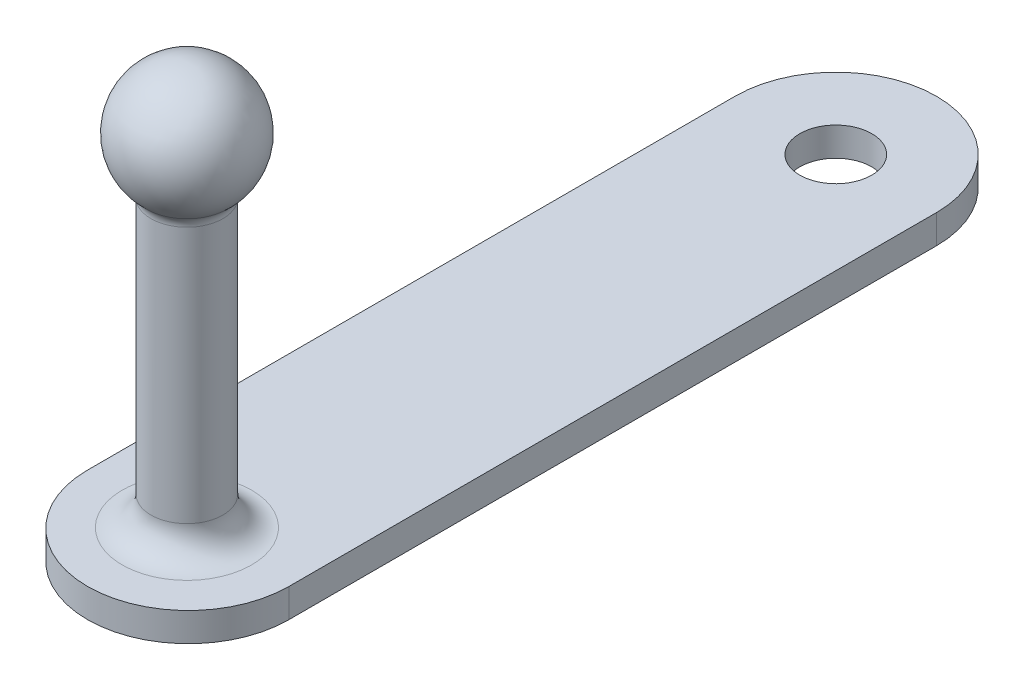
ISO-10303-21;
HEADER;
FILE_DESCRIPTION(('STEP AP214'),'2;1');
FILE_NAME('part.step','',(''),(''),'','','');
FILE_SCHEMA(('AUTOMOTIVE_DESIGN { 1 0 10303 214 1 1 1 1 }'));
ENDSEC;
DATA;
#1=APPLICATION_CONTEXT('core data for automotive mechanical design processes');
#2=APPLICATION_PROTOCOL_DEFINITION('international standard','automotive_design',2000,#1);
#3=PRODUCT_CONTEXT('',#1,'mechanical');
#4=PRODUCT('Part','Part','',(#3));
#5=PRODUCT_RELATED_PRODUCT_CATEGORY('part','',(#4));
#6=PRODUCT_DEFINITION_FORMATION('','',#4);
#7=PRODUCT_DEFINITION_CONTEXT('part definition',#1,'design');
#8=PRODUCT_DEFINITION('design','',#6,#7);
#9=PRODUCT_DEFINITION_SHAPE('','',#8);
#10=(LENGTH_UNIT() NAMED_UNIT(*) SI_UNIT(.MILLI.,.METRE.));
#11=(NAMED_UNIT(*) PLANE_ANGLE_UNIT() SI_UNIT($,.RADIAN.));
#12=(NAMED_UNIT(*) SI_UNIT($,.STERADIAN.) SOLID_ANGLE_UNIT());
#13=UNCERTAINTY_MEASURE_WITH_UNIT(LENGTH_MEASURE(1.E-05),#10,'distance_accuracy_value','');
#14=(GEOMETRIC_REPRESENTATION_CONTEXT(3) GLOBAL_UNCERTAINTY_ASSIGNED_CONTEXT((#13)) GLOBAL_UNIT_ASSIGNED_CONTEXT((#10,
#11,#12)) REPRESENTATION_CONTEXT('',''));
#15=CARTESIAN_POINT('',(0.,0.,0.));
#16=DIRECTION('',(0.,0.,1.));
#17=DIRECTION('',(1.,0.,0.));
#18=AXIS2_PLACEMENT_3D('',#15,#16,#17);
#19=CARTESIAN_POINT('',(2.5,0.,0.));
#20=DIRECTION('',(0.,-1.,0.));
#21=DIRECTION('',(0.,0.,-1.));
#22=AXIS2_PLACEMENT_3D('',#19,#20,#21);
#23=CYLINDRICAL_SURFACE('',#22,2.5);
#24=CARTESIAN_POINT('',(2.5,21.8368810393754,0.));
#25=DIRECTION('',(0.,1.,0.));
#26=DIRECTION('',(0.,0.,1.));
#27=AXIS2_PLACEMENT_3D('',#24,#25,#26);
#28=CIRCLE('',#27,2.5);
#29=CARTESIAN_POINT('',(2.5,21.8368810393754,2.5));
#30=VERTEX_POINT('',#29);
#31=EDGE_CURVE('E49',#30,#30,#28,.F.);
#32=ORIENTED_EDGE('',*,*,#31,.T.);
#33=EDGE_LOOP('',(#32));
#34=FACE_BOUND('',#33,.T.);
#35=CARTESIAN_POINT('',(2.5,4.,0.));
#36=DIRECTION('',(0.,-1.,0.));
#37=DIRECTION('',(0.,0.,-1.));
#38=AXIS2_PLACEMENT_3D('',#35,#36,#37);
#39=CIRCLE('',#38,2.5);
#40=CARTESIAN_POINT('',(2.5,4.,-2.5));
#41=VERTEX_POINT('',#40);
#42=EDGE_CURVE('E137',#41,#41,#39,.F.);
#43=ORIENTED_EDGE('',*,*,#42,.T.);
#44=EDGE_LOOP('',(#43));
#45=FACE_BOUND('',#44,.T.);
#46=ADVANCED_FACE('F39',(#34,#45),#23,.T.);
#47=CARTESIAN_POINT('',(2.5,25.75,0.));
#48=DIRECTION('',(0.,-1.,0.));
#49=DIRECTION('',(1.,0.,0.));
#50=AXIS2_PLACEMENT_3D('',#47,#48,#49);
#51=SPHERICAL_SURFACE('',#50,4.25);
#52=CARTESIAN_POINT('',(2.5,22.5822370318753,0.));
#53=DIRECTION('',(0.,1.,0.));
#54=DIRECTION('',(0.,0.,1.));
#55=AXIS2_PLACEMENT_3D('',#52,#53,#54);
#56=CIRCLE('',#55,2.83333333333333);
#57=CARTESIAN_POINT('',(2.5,22.5822370318753,2.83333333333333));
#58=VERTEX_POINT('',#57);
#59=EDGE_CURVE('E11',#58,#58,#56,.T.);
#60=ORIENTED_EDGE('',*,*,#59,.T.);
#61=EDGE_LOOP('',(#60));
#62=FACE_BOUND('',#61,.T.);
#63=ADVANCED_FACE('F156',(#62),#51,.T.);
#64=CARTESIAN_POINT('',(2.58924949571679,2.,0.));
#65=DIRECTION('',(0.,-1.,0.));
#66=DIRECTION('',(0.,0.,-1.));
#67=AXIS2_PLACEMENT_3D('',#64,#65,#66);
#68=CYLINDRICAL_SURFACE('',#67,7.);
#69=CARTESIAN_POINT('',(2.58924949571679,0.,0.));
#70=DIRECTION('',(0.,-1.,0.));
#71=DIRECTION('',(0.,0.,-1.));
#72=AXIS2_PLACEMENT_3D('',#69,#70,#71);
#73=CIRCLE('',#72,7.);
#74=CARTESIAN_POINT('',(9.58924949571679,0.,0.));
#75=VERTEX_POINT('',#74);
#76=CARTESIAN_POINT('',(-4.41075050428322,0.,0.));
#77=VERTEX_POINT('',#76);
#78=EDGE_CURVE('E114',#75,#77,#73,.T.);
#79=ORIENTED_EDGE('',*,*,#78,.F.);
#80=DIRECTION('',(0.,-1.,0.));
#81=VECTOR('',#80,1.);
#82=CARTESIAN_POINT('',(9.58924949571679,2.,0.));
#83=LINE('',#82,#81);
#84=CARTESIAN_POINT('',(9.58924949571679,2.,0.));
#85=VERTEX_POINT('',#84);
#86=EDGE_CURVE('E57',#85,#75,#83,.T.);
#87=ORIENTED_EDGE('',*,*,#86,.F.);
#88=CARTESIAN_POINT('',(2.58924949571679,2.,0.));
#89=DIRECTION('',(0.,-1.,0.));
#90=DIRECTION('',(0.,0.,-1.));
#91=AXIS2_PLACEMENT_3D('',#88,#89,#90);
#92=CIRCLE('',#91,7.);
#93=CARTESIAN_POINT('',(-4.41075050428322,2.,0.));
#94=VERTEX_POINT('',#93);
#95=EDGE_CURVE('E105',#85,#94,#92,.T.);
#96=ORIENTED_EDGE('',*,*,#95,.T.);
#97=DIRECTION('',(0.,-1.,0.));
#98=VECTOR('',#97,1.);
#99=CARTESIAN_POINT('',(-4.41075050428322,2.,0.));
#100=LINE('',#99,#98);
#101=EDGE_CURVE('E85',#94,#77,#100,.T.);
#102=ORIENTED_EDGE('',*,*,#101,.T.);
#103=EDGE_LOOP('',(#79,#87,#96,#102));
#104=FACE_BOUND('',#103,.T.);
#105=ADVANCED_FACE('F161',(#104),#68,.T.);
#106=CARTESIAN_POINT('',(9.58924949571679,2.,0.));
#107=DIRECTION('',(1.,0.,0.));
#108=DIRECTION('',(0.,0.,-1.));
#109=AXIS2_PLACEMENT_3D('',#106,#107,#108);
#110=PLANE('',#109);
#111=DIRECTION('',(0.,0.,1.));
#112=VECTOR('',#111,1.);
#113=CARTESIAN_POINT('',(9.58924949571679,0.,0.));
#114=LINE('',#113,#112);
#115=CARTESIAN_POINT('',(9.58924949571679,0.,-45.));
#116=VERTEX_POINT('',#115);
#117=EDGE_CURVE('E108',#116,#75,#114,.T.);
#118=ORIENTED_EDGE('',*,*,#117,.F.);
#119=DIRECTION('',(0.,-1.,0.));
#120=VECTOR('',#119,1.);
#121=CARTESIAN_POINT('',(9.58924949571679,2.,-45.));
#122=LINE('',#121,#120);
#123=CARTESIAN_POINT('',(9.58924949571679,2.,-45.));
#124=VERTEX_POINT('',#123);
#125=EDGE_CURVE('E74',#124,#116,#122,.T.);
#126=ORIENTED_EDGE('',*,*,#125,.F.);
#127=DIRECTION('',(0.,0.,1.));
#128=VECTOR('',#127,1.);
#129=CARTESIAN_POINT('',(9.58924949571679,2.,0.));
#130=LINE('',#129,#128);
#131=EDGE_CURVE('E100',#124,#85,#130,.T.);
#132=ORIENTED_EDGE('',*,*,#131,.T.);
#133=ORIENTED_EDGE('',*,*,#86,.T.);
#134=EDGE_LOOP('',(#118,#126,#132,#133));
#135=FACE_BOUND('',#134,.T.);
#136=ADVANCED_FACE('F179',(#135),#110,.T.);
#137=CARTESIAN_POINT('',(2.58924949571679,2.,-45.));
#138=DIRECTION('',(0.,-1.,0.));
#139=DIRECTION('',(0.,0.,-1.));
#140=AXIS2_PLACEMENT_3D('',#137,#138,#139);
#141=CYLINDRICAL_SURFACE('',#140,7.);
#142=CARTESIAN_POINT('',(2.58924949571679,0.,-45.));
#143=DIRECTION('',(0.,-1.,0.));
#144=DIRECTION('',(0.,0.,-1.));
#145=AXIS2_PLACEMENT_3D('',#142,#143,#144);
#146=CIRCLE('',#145,7.);
#147=CARTESIAN_POINT('',(-4.41075050428321,0.,-45.));
#148=VERTEX_POINT('',#147);
#149=EDGE_CURVE('E93',#148,#116,#146,.T.);
#150=ORIENTED_EDGE('',*,*,#149,.F.);
#151=DIRECTION('',(0.,-1.,0.));
#152=VECTOR('',#151,1.);
#153=CARTESIAN_POINT('',(-4.41075050428321,2.,-45.));
#154=LINE('',#153,#152);
#155=CARTESIAN_POINT('',(-4.41075050428321,2.,-45.));
#156=VERTEX_POINT('',#155);
#157=EDGE_CURVE('E88',#156,#148,#154,.T.);
#158=ORIENTED_EDGE('',*,*,#157,.F.);
#159=CARTESIAN_POINT('',(2.58924949571679,2.,-45.));
#160=DIRECTION('',(0.,-1.,0.));
#161=DIRECTION('',(0.,0.,-1.));
#162=AXIS2_PLACEMENT_3D('',#159,#160,#161);
#163=CIRCLE('',#162,7.);
#164=EDGE_CURVE('E91',#156,#124,#163,.T.);
#165=ORIENTED_EDGE('',*,*,#164,.T.);
#166=ORIENTED_EDGE('',*,*,#125,.T.);
#167=EDGE_LOOP('',(#150,#158,#165,#166));
#168=FACE_BOUND('',#167,.T.);
#169=ADVANCED_FACE('F90',(#168),#141,.T.);
#170=CARTESIAN_POINT('',(-4.41075050428322,2.,0.));
#171=DIRECTION('',(-1.,0.,0.));
#172=DIRECTION('',(0.,0.,1.));
#173=AXIS2_PLACEMENT_3D('',#170,#171,#172);
#174=PLANE('',#173);
#175=DIRECTION('',(0.,0.,-1.));
#176=VECTOR('',#175,1.);
#177=CARTESIAN_POINT('',(-4.41075050428322,0.,0.));
#178=LINE('',#177,#176);
#179=EDGE_CURVE('E118',#77,#148,#178,.T.);
#180=ORIENTED_EDGE('',*,*,#179,.F.);
#181=ORIENTED_EDGE('',*,*,#101,.F.);
#182=DIRECTION('',(0.,0.,-1.));
#183=VECTOR('',#182,1.);
#184=CARTESIAN_POINT('',(-4.41075050428322,2.,0.));
#185=LINE('',#184,#183);
#186=EDGE_CURVE('E99',#94,#156,#185,.T.);
#187=ORIENTED_EDGE('',*,*,#186,.T.);
#188=ORIENTED_EDGE('',*,*,#157,.T.);
#189=EDGE_LOOP('',(#180,#181,#187,#188));
#190=FACE_BOUND('',#189,.T.);
#191=ADVANCED_FACE('F103',(#190),#174,.T.);
#192=CARTESIAN_POINT('',(2.58924949571679,2.,0.));
#193=DIRECTION('',(0.,-1.,0.));
#194=DIRECTION('',(0.,0.,-1.));
#195=AXIS2_PLACEMENT_3D('',#192,#193,#194);
#196=PLANE('',#195);
#197=CARTESIAN_POINT('',(2.5,2.,0.));
#198=DIRECTION('',(0.,-1.,0.));
#199=DIRECTION('',(0.,0.,-1.));
#200=AXIS2_PLACEMENT_3D('',#197,#198,#199);
#201=CIRCLE('',#200,4.5);
#202=CARTESIAN_POINT('',(2.5,2.,-4.5));
#203=VERTEX_POINT('',#202);
#204=EDGE_CURVE('E129',#203,#203,#201,.T.);
#205=ORIENTED_EDGE('',*,*,#204,.T.);
#206=EDGE_LOOP('',(#205));
#207=FACE_BOUND('',#206,.T.);
#208=CARTESIAN_POINT('',(2.58924949571679,2.,-45.));
#209=DIRECTION('',(0.,-1.,0.));
#210=DIRECTION('',(0.,0.,-1.));
#211=AXIS2_PLACEMENT_3D('',#208,#209,#210);
#212=CIRCLE('',#211,2.5);
#213=CARTESIAN_POINT('',(2.58924949571679,2.,-47.5));
#214=VERTEX_POINT('',#213);
#215=EDGE_CURVE('E119',#214,#214,#212,.T.);
#216=ORIENTED_EDGE('',*,*,#215,.T.);
#217=EDGE_LOOP('',(#216));
#218=FACE_BOUND('',#217,.T.);
#219=ORIENTED_EDGE('',*,*,#95,.F.);
#220=ORIENTED_EDGE('',*,*,#131,.F.);
#221=ORIENTED_EDGE('',*,*,#164,.F.);
#222=ORIENTED_EDGE('',*,*,#186,.F.);
#223=EDGE_LOOP('',(#219,#220,#221,#222));
#224=FACE_BOUND('',#223,.T.);
#225=ADVANCED_FACE('F98',(#207,#218,#224),#196,.F.);
#226=CARTESIAN_POINT('',(2.58924949571679,2.,-45.));
#227=DIRECTION('',(0.,-1.,0.));
#228=DIRECTION('',(0.,0.,-1.));
#229=AXIS2_PLACEMENT_3D('',#226,#227,#228);
#230=CYLINDRICAL_SURFACE('',#229,2.5);
#231=ORIENTED_EDGE('',*,*,#215,.F.);
#232=EDGE_LOOP('',(#231));
#233=FACE_BOUND('',#232,.T.);
#234=CARTESIAN_POINT('',(2.58924949571679,0.,-45.));
#235=DIRECTION('',(0.,-1.,0.));
#236=DIRECTION('',(0.,0.,-1.));
#237=AXIS2_PLACEMENT_3D('',#234,#235,#236);
#238=CIRCLE('',#237,2.5);
#239=CARTESIAN_POINT('',(2.58924949571679,0.,-47.5));
#240=VERTEX_POINT('',#239);
#241=EDGE_CURVE('E178',#240,#240,#238,.T.);
#242=ORIENTED_EDGE('',*,*,#241,.T.);
#243=EDGE_LOOP('',(#242));
#244=FACE_BOUND('',#243,.T.);
#245=ADVANCED_FACE('F168',(#233,#244),#230,.F.);
#246=CARTESIAN_POINT('',(0.,0.,0.));
#247=DIRECTION('',(0.,1.,0.));
#248=DIRECTION('',(0.,0.,1.));
#249=AXIS2_PLACEMENT_3D('',#246,#247,#248);
#250=PLANE('',#249);
#251=ORIENTED_EDGE('',*,*,#241,.F.);
#252=EDGE_LOOP('',(#251));
#253=FACE_BOUND('',#252,.T.);
#254=ORIENTED_EDGE('',*,*,#78,.T.);
#255=ORIENTED_EDGE('',*,*,#179,.T.);
#256=ORIENTED_EDGE('',*,*,#149,.T.);
#257=ORIENTED_EDGE('',*,*,#117,.T.);
#258=EDGE_LOOP('',(#254,#255,#256,#257));
#259=FACE_BOUND('',#258,.T.);
#260=ADVANCED_FACE('F152',(#253,#259),#250,.F.);
#261=CARTESIAN_POINT('',(2.5,4.,0.));
#262=DIRECTION('',(0.,-1.,0.));
#263=DIRECTION('',(0.,0.,-1.));
#264=AXIS2_PLACEMENT_3D('',#261,#262,#263);
#265=TOROIDAL_SURFACE('',#264,4.5,2.);
#266=ORIENTED_EDGE('',*,*,#42,.F.);
#267=EDGE_LOOP('',(#266));
#268=FACE_BOUND('',#267,.T.);
#269=ORIENTED_EDGE('',*,*,#204,.F.);
#270=EDGE_LOOP('',(#269));
#271=FACE_BOUND('',#270,.T.);
#272=ADVANCED_FACE('F147',(#268,#271),#265,.F.);
#273=CARTESIAN_POINT('',(2.5,21.8368810393754,0.));
#274=DIRECTION('',(0.,1.,0.));
#275=DIRECTION('',(0.,0.,1.));
#276=AXIS2_PLACEMENT_3D('',#273,#274,#275);
#277=TOROIDAL_SURFACE('',#276,3.5,1.);
#278=ORIENTED_EDGE('',*,*,#59,.F.);
#279=EDGE_LOOP('',(#278));
#280=FACE_BOUND('',#279,.T.);
#281=ORIENTED_EDGE('',*,*,#31,.F.);
#282=EDGE_LOOP('',(#281));
#283=FACE_BOUND('',#282,.T.);
#284=ADVANCED_FACE('F41',(#280,#283),#277,.F.);
#285=CLOSED_SHELL('',(#46,#63,#105,#136,#169,#191,#225,#245,#260,#272,#284));
#286=MANIFOLD_SOLID_BREP('B2',#285);
#287=ADVANCED_BREP_SHAPE_REPRESENTATION('',(#18,#286),#14);
#288=SHAPE_DEFINITION_REPRESENTATION(#9,#287);
ENDSEC;
END-ISO-10303-21;
